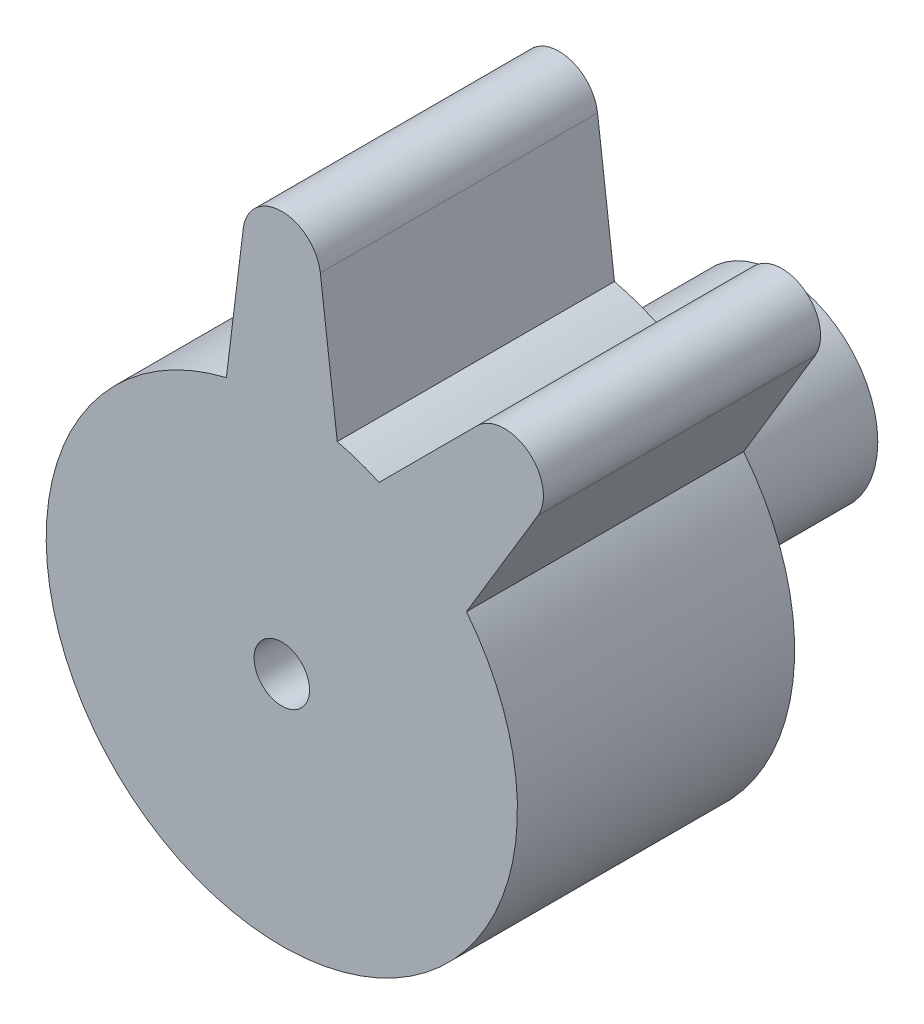
ISO-10303-21;
HEADER;
FILE_DESCRIPTION(('STEP AP214'),'2;1');
FILE_NAME('part.step','',(''),(''),'','','');
FILE_SCHEMA(('AUTOMOTIVE_DESIGN { 1 0 10303 214 1 1 1 1 }'));
ENDSEC;
DATA;
#1=APPLICATION_CONTEXT('core data for automotive mechanical design processes');
#2=APPLICATION_PROTOCOL_DEFINITION('international standard','automotive_design',2000,#1);
#3=PRODUCT_CONTEXT('',#1,'mechanical');
#4=PRODUCT('Part','Part','',(#3));
#5=PRODUCT_RELATED_PRODUCT_CATEGORY('part','',(#4));
#6=PRODUCT_DEFINITION_FORMATION('','',#4);
#7=PRODUCT_DEFINITION_CONTEXT('part definition',#1,'design');
#8=PRODUCT_DEFINITION('design','',#6,#7);
#9=PRODUCT_DEFINITION_SHAPE('','',#8);
#10=(LENGTH_UNIT() NAMED_UNIT(*) SI_UNIT(.MILLI.,.METRE.));
#11=(NAMED_UNIT(*) PLANE_ANGLE_UNIT() SI_UNIT($,.RADIAN.));
#12=(NAMED_UNIT(*) SI_UNIT($,.STERADIAN.) SOLID_ANGLE_UNIT());
#13=UNCERTAINTY_MEASURE_WITH_UNIT(LENGTH_MEASURE(1.E-05),#10,'distance_accuracy_value','');
#14=(GEOMETRIC_REPRESENTATION_CONTEXT(3) GLOBAL_UNCERTAINTY_ASSIGNED_CONTEXT((#13)) GLOBAL_UNIT_ASSIGNED_CONTEXT((#10,
#11,#12)) REPRESENTATION_CONTEXT('',''));
#15=CARTESIAN_POINT('',(0.,0.,0.));
#16=DIRECTION('',(0.,0.,1.));
#17=DIRECTION('',(1.,0.,0.));
#18=AXIS2_PLACEMENT_3D('',#15,#16,#17);
#19=CARTESIAN_POINT('',(0.,0.,0.));
#20=DIRECTION('',(0.,0.,1.));
#21=DIRECTION('',(1.,0.,0.));
#22=AXIS2_PLACEMENT_3D('',#19,#20,#21);
#23=PLANE('',#22);
#24=CARTESIAN_POINT('',(0.,0.,0.));
#25=DIRECTION('',(0.,0.,1.));
#26=DIRECTION('',(1.,0.,0.));
#27=AXIS2_PLACEMENT_3D('',#24,#25,#26);
#28=CIRCLE('',#27,1.);
#29=CARTESIAN_POINT('',(1.,0.,0.));
#30=VERTEX_POINT('',#29);
#31=EDGE_CURVE('E142',#30,#30,#28,.T.);
#32=ORIENTED_EDGE('',*,*,#31,.T.);
#33=EDGE_LOOP('',(#32));
#34=FACE_BOUND('',#33,.T.);
#35=CARTESIAN_POINT('',(0.,0.,0.));
#36=DIRECTION('',(0.,0.,-1.));
#37=DIRECTION('',(-1.,0.,0.));
#38=AXIS2_PLACEMENT_3D('',#35,#36,#37);
#39=CIRCLE('',#38,2.);
#40=CARTESIAN_POINT('',(-2.,0.,0.));
#41=VERTEX_POINT('',#40);
#42=EDGE_CURVE('E249',#41,#41,#39,.T.);
#43=ORIENTED_EDGE('',*,*,#42,.T.);
#44=EDGE_LOOP('',(#43));
#45=FACE_BOUND('',#44,.T.);
#46=ADVANCED_FACE('F35',(#34,#45),#23,.F.);
#47=CARTESIAN_POINT('',(0.,0.,10.));
#48=DIRECTION('',(0.,0.,-1.));
#49=DIRECTION('',(-1.,0.,0.));
#50=AXIS2_PLACEMENT_3D('',#47,#48,#49);
#51=CYLINDRICAL_SURFACE('',#50,8.5);
#52=CARTESIAN_POINT('',(0.,0.,0.));
#53=DIRECTION('',(0.,0.,1.));
#54=DIRECTION('',(1.,0.,0.));
#55=AXIS2_PLACEMENT_3D('',#52,#53,#54);
#56=CIRCLE('',#55,8.5);
#57=CARTESIAN_POINT('',(-2.,8.26135582092915,0.));
#58=VERTEX_POINT('',#57);
#59=CARTESIAN_POINT('',(6.66222002011691,5.27871427561234,0.));
#60=VERTEX_POINT('',#59);
#61=EDGE_CURVE('E145',#58,#60,#56,.T.);
#62=ORIENTED_EDGE('',*,*,#61,.T.);
#63=DIRECTION('',(0.,0.,-1.));
#64=VECTOR('',#63,1.);
#65=CARTESIAN_POINT('',(6.66222002011691,5.27871427561234,10.));
#66=LINE('',#65,#64);
#67=CARTESIAN_POINT('',(6.66222002011691,5.27871427561234,10.));
#68=VERTEX_POINT('',#67);
#69=EDGE_CURVE('E50',#68,#60,#66,.T.);
#70=ORIENTED_EDGE('',*,*,#69,.F.);
#71=CARTESIAN_POINT('',(0.,0.,10.));
#72=DIRECTION('',(0.,0.,1.));
#73=DIRECTION('',(1.,0.,0.));
#74=AXIS2_PLACEMENT_3D('',#71,#72,#73);
#75=CIRCLE('',#74,8.5);
#76=CARTESIAN_POINT('',(-2.,8.26135582092915,10.));
#77=VERTEX_POINT('',#76);
#78=EDGE_CURVE('E260',#77,#68,#75,.T.);
#79=ORIENTED_EDGE('',*,*,#78,.F.);
#80=DIRECTION('',(0.,0.,-1.));
#81=VECTOR('',#80,1.);
#82=CARTESIAN_POINT('',(-2.,8.26135582092915,10.));
#83=LINE('',#82,#81);
#84=EDGE_CURVE('E59',#77,#58,#83,.T.);
#85=ORIENTED_EDGE('',*,*,#84,.T.);
#86=EDGE_LOOP('',(#62,#70,#79,#85));
#87=FACE_BOUND('',#86,.T.);
#88=ADVANCED_FACE('F229',(#87),#51,.T.);
#89=CARTESIAN_POINT('',(2.56455740077132,-1.54094154735917,10.));
#90=DIRECTION('',(-0.857167300702111,0.515038074910056,0.));
#91=DIRECTION('',(-0.515038074910056,-0.857167300702112,0.));
#92=AXIS2_PLACEMENT_3D('',#89,#90,#91);
#93=PLANE('',#92);
#94=DIRECTION('',(0.515038074910056,0.857167300702112,0.));
#95=VECTOR('',#94,1.);
#96=CARTESIAN_POINT('',(2.56455740077132,-1.54094154735917,0.));
#97=LINE('',#96,#95);
#98=CARTESIAN_POINT('',(9.23741039466719,9.56455077912289,0.));
#99=VERTEX_POINT('',#98);
#100=EDGE_CURVE('E148',#60,#99,#97,.T.);
#101=ORIENTED_EDGE('',*,*,#100,.T.);
#102=DIRECTION('',(0.,0.,-1.));
#103=VECTOR('',#102,1.);
#104=CARTESIAN_POINT('',(9.23741039466719,9.56455077912289,10.));
#105=LINE('',#104,#103);
#106=CARTESIAN_POINT('',(9.23741039466719,9.56455077912289,10.));
#107=VERTEX_POINT('',#106);
#108=EDGE_CURVE('E171',#107,#99,#105,.T.);
#109=ORIENTED_EDGE('',*,*,#108,.F.);
#110=DIRECTION('',(0.515038074910056,0.857167300702112,0.));
#111=VECTOR('',#110,1.);
#112=CARTESIAN_POINT('',(2.56455740077132,-1.54094154735917,10.));
#113=LINE('',#112,#111);
#114=EDGE_CURVE('E98',#68,#107,#113,.T.);
#115=ORIENTED_EDGE('',*,*,#114,.F.);
#116=ORIENTED_EDGE('',*,*,#69,.T.);
#117=EDGE_LOOP('',(#101,#109,#115,#116));
#118=FACE_BOUND('',#117,.T.);
#119=ADVANCED_FACE('F235',(#118),#93,.F.);
#120=CARTESIAN_POINT('',(8.03643599281354,10.2861690016569,10.));
#121=DIRECTION('',(0.,0.,-1.));
#122=DIRECTION('',(-1.,0.,0.));
#123=AXIS2_PLACEMENT_3D('',#120,#121,#122);
#124=CYLINDRICAL_SURFACE('',#123,1.40109684640317);
#125=CARTESIAN_POINT('',(8.03643599281354,10.2861690016569,0.));
#126=DIRECTION('',(0.,0.,1.));
#127=DIRECTION('',(1.,0.,0.));
#128=AXIS2_PLACEMENT_3D('',#125,#126,#127);
#129=CIRCLE('',#128,1.40109684640317);
#130=CARTESIAN_POINT('',(7.04571091162277,11.2768940828477,0.));
#131=VERTEX_POINT('',#130);
#132=EDGE_CURVE('E151',#99,#131,#129,.T.);
#133=ORIENTED_EDGE('',*,*,#132,.T.);
#134=DIRECTION('',(0.,0.,-1.));
#135=VECTOR('',#134,1.);
#136=CARTESIAN_POINT('',(7.04571091162277,11.2768940828477,10.));
#137=LINE('',#136,#135);
#138=CARTESIAN_POINT('',(7.04571091162277,11.2768940828477,10.));
#139=VERTEX_POINT('',#138);
#140=EDGE_CURVE('E169',#139,#131,#137,.T.);
#141=ORIENTED_EDGE('',*,*,#140,.F.);
#142=CARTESIAN_POINT('',(8.03643599281354,10.2861690016569,10.));
#143=DIRECTION('',(0.,0.,1.));
#144=DIRECTION('',(1.,0.,0.));
#145=AXIS2_PLACEMENT_3D('',#142,#143,#144);
#146=CIRCLE('',#145,1.40109684640317);
#147=EDGE_CURVE('E263',#107,#139,#146,.T.);
#148=ORIENTED_EDGE('',*,*,#147,.F.);
#149=ORIENTED_EDGE('',*,*,#108,.T.);
#150=EDGE_LOOP('',(#133,#141,#148,#149));
#151=FACE_BOUND('',#150,.T.);
#152=ADVANCED_FACE('F232',(#151),#124,.T.);
#153=CARTESIAN_POINT('',(-2.11559158561248,2.11559158561249,10.));
#154=DIRECTION('',(-0.707106781186546,0.707106781186549,0.));
#155=DIRECTION('',(-0.707106781186549,-0.707106781186546,0.));
#156=AXIS2_PLACEMENT_3D('',#153,#154,#155);
#157=PLANE('',#156);
#158=DIRECTION('',(0.707106781186549,0.707106781186546,0.));
#159=VECTOR('',#158,1.);
#160=CARTESIAN_POINT('',(-2.11559158561248,2.11559158561249,0.));
#161=LINE('',#160,#159);
#162=CARTESIAN_POINT('',(3.51017700569002,7.74136017691497,0.));
#163=VERTEX_POINT('',#162);
#164=EDGE_CURVE('E154',#163,#131,#161,.T.);
#165=ORIENTED_EDGE('',*,*,#164,.F.);
#166=DIRECTION('',(0.,0.,-1.));
#167=VECTOR('',#166,1.);
#168=CARTESIAN_POINT('',(3.51017700569002,7.74136017691497,10.));
#169=LINE('',#168,#167);
#170=CARTESIAN_POINT('',(3.51017700569002,7.74136017691497,10.));
#171=VERTEX_POINT('',#170);
#172=EDGE_CURVE('E167',#171,#163,#169,.T.);
#173=ORIENTED_EDGE('',*,*,#172,.F.);
#174=DIRECTION('',(0.707106781186549,0.707106781186546,0.));
#175=VECTOR('',#174,1.);
#176=CARTESIAN_POINT('',(-2.11559158561248,2.11559158561249,10.));
#177=LINE('',#176,#175);
#178=EDGE_CURVE('E264',#171,#139,#177,.T.);
#179=ORIENTED_EDGE('',*,*,#178,.T.);
#180=ORIENTED_EDGE('',*,*,#140,.T.);
#181=EDGE_LOOP('',(#165,#173,#179,#180));
#182=FACE_BOUND('',#181,.T.);
#183=ADVANCED_FACE('F227',(#182),#157,.T.);
#184=CARTESIAN_POINT('',(2.,8.26135582092915,0.));
#185=VERTEX_POINT('',#184);
#186=EDGE_CURVE('E149',#163,#185,#56,.T.);
#187=ORIENTED_EDGE('',*,*,#186,.T.);
#188=DIRECTION('',(0.,0.,-1.));
#189=VECTOR('',#188,1.);
#190=CARTESIAN_POINT('',(2.,8.26135582092915,10.));
#191=LINE('',#190,#189);
#192=CARTESIAN_POINT('',(2.,8.26135582092915,10.));
#193=VERTEX_POINT('',#192);
#194=EDGE_CURVE('E134',#193,#185,#191,.T.);
#195=ORIENTED_EDGE('',*,*,#194,.F.);
#196=EDGE_CURVE('E122',#171,#193,#75,.T.);
#197=ORIENTED_EDGE('',*,*,#196,.F.);
#198=ORIENTED_EDGE('',*,*,#172,.T.);
#199=EDGE_LOOP('',(#187,#195,#197,#198));
#200=FACE_BOUND('',#199,.T.);
#201=ADVANCED_FACE('F224',(#200),#51,.T.);
#202=CARTESIAN_POINT('',(2.96959715648726,0.364620682917803,10.));
#203=DIRECTION('',(-0.992546151641322,-0.121869343405148,0.));
#204=DIRECTION('',(0.121869343405148,-0.992546151641322,0.));
#205=AXIS2_PLACEMENT_3D('',#202,#203,#204);
#206=PLANE('',#205);
#207=DIRECTION('',(-0.121869343405148,0.992546151641322,0.));
#208=VECTOR('',#207,1.);
#209=CARTESIAN_POINT('',(2.96959715648726,0.364620682917803,0.));
#210=LINE('',#209,#208);
#211=CARTESIAN_POINT('',(1.39065328297426,13.2240865791358,0.));
#212=VERTEX_POINT('',#211);
#213=EDGE_CURVE('E131',#185,#212,#210,.T.);
#214=ORIENTED_EDGE('',*,*,#213,.T.);
#215=DIRECTION('',(0.,0.,-1.));
#216=VECTOR('',#215,1.);
#217=CARTESIAN_POINT('',(1.39065328297426,13.2240865791358,10.));
#218=LINE('',#217,#216);
#219=CARTESIAN_POINT('',(1.39065328297426,13.2240865791358,10.));
#220=VERTEX_POINT('',#219);
#221=EDGE_CURVE('E128',#220,#212,#218,.T.);
#222=ORIENTED_EDGE('',*,*,#221,.F.);
#223=DIRECTION('',(-0.121869343405148,0.992546151641322,0.));
#224=VECTOR('',#223,1.);
#225=CARTESIAN_POINT('',(2.96959715648726,0.364620682917803,10.));
#226=LINE('',#225,#224);
#227=EDGE_CURVE('E114',#193,#220,#226,.T.);
#228=ORIENTED_EDGE('',*,*,#227,.F.);
#229=ORIENTED_EDGE('',*,*,#194,.T.);
#230=EDGE_LOOP('',(#214,#222,#228,#229));
#231=FACE_BOUND('',#230,.T.);
#232=ADVANCED_FACE('F129',(#231),#206,.F.);
#233=CARTESIAN_POINT('',(0.,13.0533358264176,10.));
#234=DIRECTION('',(0.,0.,-1.));
#235=DIRECTION('',(-1.,0.,0.));
#236=AXIS2_PLACEMENT_3D('',#233,#234,#235);
#237=CYLINDRICAL_SURFACE('',#236,1.40109684640317);
#238=CARTESIAN_POINT('',(0.,13.0533358264176,0.));
#239=DIRECTION('',(0.,0.,1.));
#240=DIRECTION('',(1.,0.,0.));
#241=AXIS2_PLACEMENT_3D('',#238,#239,#240);
#242=CIRCLE('',#241,1.40109684640317);
#243=CARTESIAN_POINT('',(-1.39065328297426,13.2240865791358,0.));
#244=VERTEX_POINT('',#243);
#245=EDGE_CURVE('E158',#244,#212,#242,.F.);
#246=ORIENTED_EDGE('',*,*,#245,.F.);
#247=DIRECTION('',(0.,0.,-1.));
#248=VECTOR('',#247,1.);
#249=CARTESIAN_POINT('',(-1.39065328297426,13.2240865791358,10.));
#250=LINE('',#249,#248);
#251=CARTESIAN_POINT('',(-1.39065328297426,13.2240865791358,10.));
#252=VERTEX_POINT('',#251);
#253=EDGE_CURVE('E85',#252,#244,#250,.T.);
#254=ORIENTED_EDGE('',*,*,#253,.F.);
#255=CARTESIAN_POINT('',(0.,13.0533358264176,10.));
#256=DIRECTION('',(0.,0.,1.));
#257=DIRECTION('',(1.,0.,0.));
#258=AXIS2_PLACEMENT_3D('',#255,#256,#257);
#259=CIRCLE('',#258,1.40109684640317);
#260=EDGE_CURVE('E119',#252,#220,#259,.F.);
#261=ORIENTED_EDGE('',*,*,#260,.T.);
#262=ORIENTED_EDGE('',*,*,#221,.T.);
#263=EDGE_LOOP('',(#246,#254,#261,#262));
#264=FACE_BOUND('',#263,.T.);
#265=ADVANCED_FACE('F136',(#264),#237,.T.);
#266=CARTESIAN_POINT('',(0.,0.,10.));
#267=DIRECTION('',(0.,0.,-1.));
#268=DIRECTION('',(-1.,0.,0.));
#269=AXIS2_PLACEMENT_3D('',#266,#267,#268);
#270=CYLINDRICAL_SURFACE('',#269,1.);
#271=CARTESIAN_POINT('',(0.,0.,10.));
#272=DIRECTION('',(0.,0.,1.));
#273=DIRECTION('',(1.,0.,0.));
#274=AXIS2_PLACEMENT_3D('',#271,#272,#273);
#275=CIRCLE('',#274,1.);
#276=CARTESIAN_POINT('',(1.,0.,10.));
#277=VERTEX_POINT('',#276);
#278=EDGE_CURVE('E163',#277,#277,#275,.T.);
#279=ORIENTED_EDGE('',*,*,#278,.T.);
#280=EDGE_LOOP('',(#279));
#281=FACE_BOUND('',#280,.T.);
#282=ORIENTED_EDGE('',*,*,#31,.F.);
#283=EDGE_LOOP('',(#282));
#284=FACE_BOUND('',#283,.T.);
#285=ADVANCED_FACE('F37',(#281,#284),#270,.F.);
#286=CARTESIAN_POINT('',(-2.96959715648726,0.364620682917804,10.));
#287=DIRECTION('',(-0.992546151641322,0.121869343405148,0.));
#288=DIRECTION('',(-0.121869343405148,-0.992546151641322,0.));
#289=AXIS2_PLACEMENT_3D('',#286,#287,#288);
#290=PLANE('',#289);
#291=DIRECTION('',(0.121869343405148,0.992546151641322,0.));
#292=VECTOR('',#291,1.);
#293=CARTESIAN_POINT('',(-2.96959715648726,0.364620682917804,0.));
#294=LINE('',#293,#292);
#295=EDGE_CURVE('E160',#58,#244,#294,.T.);
#296=ORIENTED_EDGE('',*,*,#295,.F.);
#297=ORIENTED_EDGE('',*,*,#84,.F.);
#298=DIRECTION('',(0.121869343405148,0.992546151641322,0.));
#299=VECTOR('',#298,1.);
#300=CARTESIAN_POINT('',(-2.96959715648726,0.364620682917804,10.));
#301=LINE('',#300,#299);
#302=EDGE_CURVE('E137',#77,#252,#301,.T.);
#303=ORIENTED_EDGE('',*,*,#302,.T.);
#304=ORIENTED_EDGE('',*,*,#253,.T.);
#305=EDGE_LOOP('',(#296,#297,#303,#304));
#306=FACE_BOUND('',#305,.T.);
#307=ADVANCED_FACE('F213',(#306),#290,.T.);
#308=CARTESIAN_POINT('',(0.,0.,10.));
#309=DIRECTION('',(0.,0.,1.));
#310=DIRECTION('',(1.,0.,0.));
#311=AXIS2_PLACEMENT_3D('',#308,#309,#310);
#312=PLANE('',#311);
#313=ORIENTED_EDGE('',*,*,#278,.F.);
#314=EDGE_LOOP('',(#313));
#315=FACE_BOUND('',#314,.T.);
#316=ORIENTED_EDGE('',*,*,#78,.T.);
#317=ORIENTED_EDGE('',*,*,#114,.T.);
#318=ORIENTED_EDGE('',*,*,#147,.T.);
#319=ORIENTED_EDGE('',*,*,#178,.F.);
#320=ORIENTED_EDGE('',*,*,#196,.T.);
#321=ORIENTED_EDGE('',*,*,#227,.T.);
#322=ORIENTED_EDGE('',*,*,#260,.F.);
#323=ORIENTED_EDGE('',*,*,#302,.F.);
#324=EDGE_LOOP('',(#316,#317,#318,#319,#320,#321,#322,#323));
#325=FACE_BOUND('',#324,.T.);
#326=ADVANCED_FACE('F116',(#315,#325),#312,.T.);
#327=CARTESIAN_POINT('',(0.,0.,0.));
#328=DIRECTION('',(0.,0.,1.));
#329=DIRECTION('',(1.,0.,0.));
#330=AXIS2_PLACEMENT_3D('',#327,#328,#329);
#331=CIRCLE('',#330,3.5);
#332=CARTESIAN_POINT('',(3.5,0.,0.));
#333=VERTEX_POINT('',#332);
#334=EDGE_CURVE('E11',#333,#333,#331,.F.);
#335=ORIENTED_EDGE('',*,*,#334,.F.);
#336=EDGE_LOOP('',(#335));
#337=FACE_BOUND('',#336,.T.);
#338=ORIENTED_EDGE('',*,*,#61,.F.);
#339=ORIENTED_EDGE('',*,*,#295,.T.);
#340=ORIENTED_EDGE('',*,*,#245,.T.);
#341=ORIENTED_EDGE('',*,*,#213,.F.);
#342=ORIENTED_EDGE('',*,*,#186,.F.);
#343=ORIENTED_EDGE('',*,*,#164,.T.);
#344=ORIENTED_EDGE('',*,*,#132,.F.);
#345=ORIENTED_EDGE('',*,*,#100,.F.);
#346=EDGE_LOOP('',(#338,#339,#340,#341,#342,#343,#344,#345));
#347=FACE_BOUND('',#346,.T.);
#348=ADVANCED_FACE('F212',(#337,#347),#23,.F.);
#349=CARTESIAN_POINT('',(0.,0.,-8.));
#350=DIRECTION('',(0.,0.,-1.));
#351=DIRECTION('',(-1.,0.,0.));
#352=AXIS2_PLACEMENT_3D('',#349,#350,#351);
#353=PLANE('',#352);
#354=CARTESIAN_POINT('',(0.,0.,-8.));
#355=DIRECTION('',(0.,0.,-1.));
#356=DIRECTION('',(-1.,0.,0.));
#357=AXIS2_PLACEMENT_3D('',#354,#355,#356);
#358=CIRCLE('',#357,3.5);
#359=CARTESIAN_POINT('',(-3.5,0.,-8.));
#360=VERTEX_POINT('',#359);
#361=EDGE_CURVE('E146',#360,#360,#358,.T.);
#362=ORIENTED_EDGE('',*,*,#361,.T.);
#363=EDGE_LOOP('',(#362));
#364=FACE_BOUND('',#363,.T.);
#365=CARTESIAN_POINT('',(0.,0.,-8.));
#366=DIRECTION('',(0.,0.,-1.));
#367=DIRECTION('',(-1.,0.,0.));
#368=AXIS2_PLACEMENT_3D('',#365,#366,#367);
#369=CIRCLE('',#368,2.);
#370=CARTESIAN_POINT('',(-2.,0.,-8.));
#371=VERTEX_POINT('',#370);
#372=EDGE_CURVE('E251',#371,#371,#369,.T.);
#373=ORIENTED_EDGE('',*,*,#372,.F.);
#374=EDGE_LOOP('',(#373));
#375=FACE_BOUND('',#374,.T.);
#376=ADVANCED_FACE('F207',(#364,#375),#353,.T.);
#377=CARTESIAN_POINT('',(0.,0.,-8.));
#378=DIRECTION('',(0.,0.,1.));
#379=DIRECTION('',(1.,0.,0.));
#380=AXIS2_PLACEMENT_3D('',#377,#378,#379);
#381=CYLINDRICAL_SURFACE('',#380,3.5);
#382=CARTESIAN_POINT('',(3.5,0.,-3.5));
#383=CARTESIAN_POINT('',(3.49999934647171,-0.0549774511886256,-3.49999903021903));
#384=CARTESIAN_POINT('',(3.49869208701023,-0.109964873936291,-3.49545110551194));
#385=CARTESIAN_POINT('',(3.4936045297255,-0.218345995598494,-3.47741786494884));
#386=CARTESIAN_POINT('',(3.48982329605034,-0.271739083414807,-3.46392916696296));
#387=CARTESIAN_POINT('',(3.48020345674544,-0.375352150368936,-3.42849598079175));
#388=CARTESIAN_POINT('',(3.474367720532,-0.425576440424114,-3.40656328192402));
#389=CARTESIAN_POINT('',(3.46124989158242,-0.521634380564634,-3.35491100426084));
#390=CARTESIAN_POINT('',(3.45396764753901,-0.567467570589077,-3.32519061075486));
#391=CARTESIAN_POINT('',(3.43852367312902,-0.654647223429478,-3.2579824946635));
#392=CARTESIAN_POINT('',(3.4303452097302,-0.69586186119049,-3.22032762307222));
#393=CARTESIAN_POINT('',(3.41413367457396,-0.771485678962155,-3.13867612843131));
#394=CARTESIAN_POINT('',(3.40610062478085,-0.805893838538838,-3.09467855618443));
#395=CARTESIAN_POINT('',(3.39091507439313,-0.867598950032228,-3.00050320860399));
#396=CARTESIAN_POINT('',(3.38378351259108,-0.894739105517028,-2.95021900746547));
#397=CARTESIAN_POINT('',(3.37145671914235,-0.940125852769615,-2.84556399412672));
#398=CARTESIAN_POINT('',(3.36626107099664,-0.958374357777524,-2.7911940639724));
#399=CARTESIAN_POINT('',(3.35856804120241,-0.984992165068876,-2.68138261841595));
#400=CARTESIAN_POINT('',(3.35600489366891,-0.993602766016075,-2.62600431860089));
#401=CARTESIAN_POINT('',(3.35367104182518,-1.00145333894795,-2.51453442575838));
#402=CARTESIAN_POINT('',(3.35389973075333,-1.00069534704803,-2.45844299036685));
#403=CARTESIAN_POINT('',(3.35706517184156,-0.990020673813953,-2.3490656942732));
#404=CARTESIAN_POINT('',(3.35991391343389,-0.980401628641805,-2.29574782440996));
#405=CARTESIAN_POINT('',(3.36785674196985,-0.952756930429097,-2.19151639018586));
#406=CARTESIAN_POINT('',(3.37295103189706,-0.934730517406289,-2.14060304363966));
#407=CARTESIAN_POINT('',(3.38488431756517,-0.890553405689019,-2.04187687778419));
#408=CARTESIAN_POINT('',(3.39174458202416,-0.864302755864396,-1.99411146379919));
#409=CARTESIAN_POINT('',(3.40642608441438,-0.804491895839434,-1.90356171939327));
#410=CARTESIAN_POINT('',(3.41424753611068,-0.770930058366727,-1.86077850113254));
#411=CARTESIAN_POINT('',(3.43033125328062,-0.695951998365101,-1.77971381219682));
#412=CARTESIAN_POINT('',(3.43859902286152,-0.654287437422663,-1.74166276201639));
#413=CARTESIAN_POINT('',(3.45438123609203,-0.565066141193113,-1.67303699817986));
#414=CARTESIAN_POINT('',(3.46189564068921,-0.517509100740946,-1.64246267197914));
#415=CARTESIAN_POINT('',(3.47538264032742,-0.417461536545722,-1.58953563261298));
#416=CARTESIAN_POINT('',(3.48134637748612,-0.364944908905002,-1.56722985659791));
#417=CARTESIAN_POINT('',(3.49099625743795,-0.256696614983734,-1.53183305429159));
#418=CARTESIAN_POINT('',(3.49468297428128,-0.200965762905073,-1.51873970537736));
#419=CARTESIAN_POINT('',(3.49927437257336,-0.0898331943221744,-1.50251335714527));
#420=CARTESIAN_POINT('',(3.50026636425301,-0.0344806734302532,-1.49906765231349));
#421=CARTESIAN_POINT('',(3.49961042353544,0.0760132634027914,-1.50136363315052));
#422=CARTESIAN_POINT('',(3.49796280790308,0.131154703878553,-1.50710421642296));
#423=CARTESIAN_POINT('',(3.49226963342609,0.238509316715159,-1.52735522215813));
#424=CARTESIAN_POINT('',(3.48827306508862,0.290759105867427,-1.54168659066171));
#425=CARTESIAN_POINT('',(3.4783399937092,0.392104343102815,-1.57850025099232));
#426=CARTESIAN_POINT('',(3.47240326632854,0.441199425624338,-1.60098348544461));
#427=CARTESIAN_POINT('',(3.45904980584657,0.536020842560038,-1.65401166832262));
#428=CARTESIAN_POINT('',(3.45160381589488,0.581651243270127,-1.68472059941289));
#429=CARTESIAN_POINT('',(3.43608973548903,0.667219264029655,-1.75312625297532));
#430=CARTESIAN_POINT('',(3.42802150376367,0.707155585421215,-1.79082456503143));
#431=CARTESIAN_POINT('',(3.41184309815947,0.781553214170353,-1.8736046710256));
#432=CARTESIAN_POINT('',(3.40374018433795,0.81579271370477,-1.91888763778285));
#433=CARTESIAN_POINT('',(3.38869447362751,0.876197658032581,-2.01473129430901));
#434=CARTESIAN_POINT('',(3.3817516363796,0.902363383738855,-2.06529180037321));
#435=CARTESIAN_POINT('',(3.36989325638715,0.945687270594172,-2.17004560549588));
#436=CARTESIAN_POINT('',(3.36496700079018,0.962893166212217,-2.22421788178634));
#437=CARTESIAN_POINT('',(3.35771228398834,0.987897250353704,-2.33485496782719));
#438=CARTESIAN_POINT('',(3.35538303564047,0.995698289511611,-2.391319077551));
#439=CARTESIAN_POINT('',(3.35365851547575,1.00149012123096,-2.50264801646077));
#440=CARTESIAN_POINT('',(3.35415580399703,0.999840138221142,-2.55749275227629));
#441=CARTESIAN_POINT('',(3.35777298607399,0.987623554788215,-2.66608736533289));
#442=CARTESIAN_POINT('',(3.36089279211716,0.977057251899602,-2.7198372790465));
#443=CARTESIAN_POINT('',(3.36933488579116,0.947529844083142,-2.82418918558376));
#444=CARTESIAN_POINT('',(3.37463438524179,0.928655458931764,-2.87481769350544));
#445=CARTESIAN_POINT('',(3.38683651421364,0.883114746507969,-2.97222936724624));
#446=CARTESIAN_POINT('',(3.3937394274128,0.856447040215778,-3.01901185063665));
#447=CARTESIAN_POINT('',(3.40865834474881,0.795032732674125,-3.10909176090262));
#448=CARTESIAN_POINT('',(3.41670381589509,0.760046138613656,-3.15222069567097));
#449=CARTESIAN_POINT('',(3.43284922546139,0.683429920189678,-3.23211194790492));
#450=CARTESIAN_POINT('',(3.4409491770859,0.64179862536428,-3.2688726595554));
#451=CARTESIAN_POINT('',(3.45653979786176,0.551787160432695,-3.33591859216331));
#452=CARTESIAN_POINT('',(3.46400950518705,0.50326125117989,-3.36601349363481));
#453=CARTESIAN_POINT('',(3.47725697888987,0.401625264823331,-3.417572892511));
#454=CARTESIAN_POINT('',(3.48303566935144,0.348517712057369,-3.43904210596653));
#455=CARTESIAN_POINT('',(3.49163672362653,0.246458157667517,-3.47042377569772));
#456=CARTESIAN_POINT('',(3.49474842181038,0.197881503812195,-3.48148676834228));
#457=CARTESIAN_POINT('',(3.49893021926074,0.0995391843931833,-3.49627482862107));
#458=CARTESIAN_POINT('',(3.50000059166997,0.0497736788080458,-3.50000087798844));
#459=CARTESIAN_POINT('',(3.5,0.,-3.5));
#460=B_SPLINE_CURVE_WITH_KNOTS('',3,(#382,#383,#384,#385,#386,#387,#388,#389,#390,#391,#392,
#393,#394,#395,#396,#397,#398,#399,#400,#401,#402,#403,#404,#405,#406,#407,#408,#409,#410,#411,
#412,#413,#414,#415,#416,#417,#418,#419,#420,#421,#422,#423,#424,#425,#426,#427,#428,#429,#430,
#431,#432,#433,#434,#435,#436,#437,#438,#439,#440,#441,#442,#443,#444,#445,#446,#447,#448,#449,
#450,#451,#452,#453,#454,#455,#456,#457,#458,#459),.UNSPECIFIED.,.T.,.F.,(4,2,2,2,2,2,2,2,2,2,2,
2,2,2,2,2,2,2,2,2,2,2,2,2,2,2,2,2,2,2,2,2,2,2,2,2,2,2,4),(0.,0.164749656271172,0.32956166989759,
0.494144406447672,0.658744367717579,0.827239057653907,0.995758989368567,1.16766537650029,
1.33953475772405,1.50699754929408,1.67442394611628,1.83642392910678,1.99843855889074,
2.16250401641616,2.32660602784683,2.49689250297262,2.66718780073736,2.83843550548235,
3.00964002003317,3.17522728845111,3.34079468713335,3.50302570235771,3.66527548283776,
3.83103762668237,3.99683751589905,4.16806052438178,4.3392775747866,4.50957286677749,
4.6798165288708,4.84363340801449,5.00744482086202,5.16958548138845,5.33175484992001,
5.49933828438395,5.66696391547449,5.83888989478295,6.01072174610257,6.15989734012186,
6.30905297207072),.UNSPECIFIED.);
#461=CARTESIAN_POINT('',(3.5,0.,-3.5));
#462=VERTEX_POINT('',#461);
#463=EDGE_CURVE('E198',#462,#462,#460,.T.);
#464=ORIENTED_EDGE('',*,*,#463,.T.);
#465=EDGE_LOOP('',(#464));
#466=FACE_BOUND('',#465,.T.);
#467=CARTESIAN_POINT('',(-3.5,0.,-3.5));
#468=CARTESIAN_POINT('',(-3.49999934647171,0.0549774511886256,-3.49999903021903));
#469=CARTESIAN_POINT('',(-3.49869208701023,0.109964873936291,-3.49545110551194));
#470=CARTESIAN_POINT('',(-3.4936045297255,0.218345995598494,-3.47741786494884));
#471=CARTESIAN_POINT('',(-3.48982329605034,0.271739083414807,-3.46392916696296));
#472=CARTESIAN_POINT('',(-3.48020345674544,0.375352150368936,-3.42849598079175));
#473=CARTESIAN_POINT('',(-3.474367720532,0.425576440424114,-3.40656328192402));
#474=CARTESIAN_POINT('',(-3.46124989158242,0.521634380564634,-3.35491100426084));
#475=CARTESIAN_POINT('',(-3.45396764753901,0.567467570589077,-3.32519061075486));
#476=CARTESIAN_POINT('',(-3.43852367312902,0.654647223429478,-3.2579824946635));
#477=CARTESIAN_POINT('',(-3.4303452097302,0.69586186119049,-3.22032762307222));
#478=CARTESIAN_POINT('',(-3.41413367457396,0.771485678962155,-3.13867612843131));
#479=CARTESIAN_POINT('',(-3.40610062478085,0.805893838538838,-3.09467855618443));
#480=CARTESIAN_POINT('',(-3.39091507439313,0.867598950032228,-3.00050320860399));
#481=CARTESIAN_POINT('',(-3.38378351259108,0.894739105517028,-2.95021900746547));
#482=CARTESIAN_POINT('',(-3.37145671914235,0.940125852769615,-2.84556399412672));
#483=CARTESIAN_POINT('',(-3.36626107099664,0.958374357777524,-2.7911940639724));
#484=CARTESIAN_POINT('',(-3.35856804120241,0.984992165068876,-2.68138261841595));
#485=CARTESIAN_POINT('',(-3.35600489366891,0.993602766016075,-2.62600431860089));
#486=CARTESIAN_POINT('',(-3.35367104182518,1.00145333894795,-2.51453442575838));
#487=CARTESIAN_POINT('',(-3.35389973075333,1.00069534704803,-2.45844299036685));
#488=CARTESIAN_POINT('',(-3.35706517184156,0.990020673813953,-2.3490656942732));
#489=CARTESIAN_POINT('',(-3.35991391343389,0.980401628641805,-2.29574782440996));
#490=CARTESIAN_POINT('',(-3.36785674196985,0.952756930429097,-2.19151639018586));
#491=CARTESIAN_POINT('',(-3.37295103189706,0.934730517406289,-2.14060304363966));
#492=CARTESIAN_POINT('',(-3.38488431756517,0.890553405689019,-2.04187687778419));
#493=CARTESIAN_POINT('',(-3.39174458202416,0.864302755864396,-1.99411146379919));
#494=CARTESIAN_POINT('',(-3.40642608441438,0.804491895839434,-1.90356171939327));
#495=CARTESIAN_POINT('',(-3.41424753611068,0.770930058366727,-1.86077850113254));
#496=CARTESIAN_POINT('',(-3.43033125328062,0.695951998365101,-1.77971381219682));
#497=CARTESIAN_POINT('',(-3.43859902286152,0.654287437422663,-1.74166276201639));
#498=CARTESIAN_POINT('',(-3.45438123609203,0.565066141193113,-1.67303699817986));
#499=CARTESIAN_POINT('',(-3.46189564068921,0.517509100740946,-1.64246267197914));
#500=CARTESIAN_POINT('',(-3.47538264032742,0.417461536545722,-1.58953563261298));
#501=CARTESIAN_POINT('',(-3.48134637748612,0.364944908905002,-1.56722985659791));
#502=CARTESIAN_POINT('',(-3.49099625743795,0.256696614983734,-1.53183305429159));
#503=CARTESIAN_POINT('',(-3.49468297428128,0.200965762905073,-1.51873970537736));
#504=CARTESIAN_POINT('',(-3.49927437257336,0.0898331943221744,-1.50251335714527));
#505=CARTESIAN_POINT('',(-3.50026636425301,0.0344806734302532,-1.49906765231349));
#506=CARTESIAN_POINT('',(-3.49961042353544,-0.0760132634027914,-1.50136363315052));
#507=CARTESIAN_POINT('',(-3.49796280790308,-0.131154703878553,-1.50710421642296));
#508=CARTESIAN_POINT('',(-3.49226963342609,-0.238509316715159,-1.52735522215813));
#509=CARTESIAN_POINT('',(-3.48827306508862,-0.290759105867427,-1.54168659066171));
#510=CARTESIAN_POINT('',(-3.4783399937092,-0.392104343102815,-1.57850025099232));
#511=CARTESIAN_POINT('',(-3.47240326632854,-0.441199425624338,-1.60098348544461));
#512=CARTESIAN_POINT('',(-3.45904980584657,-0.536020842560038,-1.65401166832262));
#513=CARTESIAN_POINT('',(-3.45160381589488,-0.581651243270127,-1.68472059941289));
#514=CARTESIAN_POINT('',(-3.43608973548903,-0.667219264029655,-1.75312625297532));
#515=CARTESIAN_POINT('',(-3.42802150376367,-0.707155585421215,-1.79082456503143));
#516=CARTESIAN_POINT('',(-3.41184309815947,-0.781553214170353,-1.8736046710256));
#517=CARTESIAN_POINT('',(-3.40374018433795,-0.81579271370477,-1.91888763778285));
#518=CARTESIAN_POINT('',(-3.38869447362751,-0.876197658032581,-2.01473129430901));
#519=CARTESIAN_POINT('',(-3.3817516363796,-0.902363383738855,-2.06529180037321));
#520=CARTESIAN_POINT('',(-3.36989325638715,-0.945687270594172,-2.17004560549588));
#521=CARTESIAN_POINT('',(-3.36496700079018,-0.962893166212217,-2.22421788178634));
#522=CARTESIAN_POINT('',(-3.35771228398834,-0.987897250353704,-2.33485496782719));
#523=CARTESIAN_POINT('',(-3.35538303564047,-0.995698289511611,-2.391319077551));
#524=CARTESIAN_POINT('',(-3.35365851547575,-1.00149012123096,-2.50264801646077));
#525=CARTESIAN_POINT('',(-3.35415580399703,-0.999840138221142,-2.55749275227629));
#526=CARTESIAN_POINT('',(-3.35777298607399,-0.987623554788215,-2.66608736533289));
#527=CARTESIAN_POINT('',(-3.36089279211716,-0.977057251899602,-2.7198372790465));
#528=CARTESIAN_POINT('',(-3.36933488579116,-0.947529844083142,-2.82418918558376));
#529=CARTESIAN_POINT('',(-3.37463438524179,-0.928655458931764,-2.87481769350544));
#530=CARTESIAN_POINT('',(-3.38683651421364,-0.883114746507969,-2.97222936724624));
#531=CARTESIAN_POINT('',(-3.3937394274128,-0.856447040215778,-3.01901185063665));
#532=CARTESIAN_POINT('',(-3.40865834474881,-0.795032732674125,-3.10909176090262));
#533=CARTESIAN_POINT('',(-3.41670381589509,-0.760046138613656,-3.15222069567097));
#534=CARTESIAN_POINT('',(-3.43284922546139,-0.683429920189678,-3.23211194790492));
#535=CARTESIAN_POINT('',(-3.4409491770859,-0.64179862536428,-3.2688726595554));
#536=CARTESIAN_POINT('',(-3.45653979786176,-0.551787160432695,-3.33591859216331));
#537=CARTESIAN_POINT('',(-3.46400950518705,-0.50326125117989,-3.36601349363481));
#538=CARTESIAN_POINT('',(-3.47725697888987,-0.401625264823331,-3.417572892511));
#539=CARTESIAN_POINT('',(-3.48303566935144,-0.348517712057369,-3.43904210596653));
#540=CARTESIAN_POINT('',(-3.49163672362653,-0.246458157667517,-3.47042377569772));
#541=CARTESIAN_POINT('',(-3.49474842181038,-0.197881503812195,-3.48148676834228));
#542=CARTESIAN_POINT('',(-3.49893021926074,-0.0995391843931833,-3.49627482862107));
#543=CARTESIAN_POINT('',(-3.50000059166997,-0.0497736788080458,-3.50000087798844));
#544=CARTESIAN_POINT('',(-3.5,0.,-3.5));
#545=B_SPLINE_CURVE_WITH_KNOTS('',3,(#467,#468,#469,#470,#471,#472,#473,#474,#475,#476,#477,
#478,#479,#480,#481,#482,#483,#484,#485,#486,#487,#488,#489,#490,#491,#492,#493,#494,#495,#496,
#497,#498,#499,#500,#501,#502,#503,#504,#505,#506,#507,#508,#509,#510,#511,#512,#513,#514,#515,
#516,#517,#518,#519,#520,#521,#522,#523,#524,#525,#526,#527,#528,#529,#530,#531,#532,#533,#534,
#535,#536,#537,#538,#539,#540,#541,#542,#543,#544),.UNSPECIFIED.,.T.,.F.,(4,2,2,2,2,2,2,2,2,2,2,
2,2,2,2,2,2,2,2,2,2,2,2,2,2,2,2,2,2,2,2,2,2,2,2,2,2,2,4),(0.,0.164749656271172,0.32956166989759,
0.494144406447672,0.658744367717579,0.827239057653907,0.995758989368567,1.16766537650029,
1.33953475772405,1.50699754929408,1.67442394611628,1.83642392910678,1.99843855889074,
2.16250401641616,2.32660602784683,2.49689250297262,2.66718780073736,2.83843550548235,
3.00964002003317,3.17522728845111,3.34079468713335,3.50302570235771,3.66527548283776,
3.83103762668237,3.99683751589905,4.16806052438178,4.3392775747866,4.50957286677749,
4.6798165288708,4.84363340801449,5.00744482086202,5.16958548138845,5.33175484992001,
5.49933828438395,5.66696391547449,5.83888989478295,6.01072174610257,6.15989734012186,
6.30905297207072),.UNSPECIFIED.);
#546=CARTESIAN_POINT('',(-3.5,0.,-3.5));
#547=VERTEX_POINT('',#546);
#548=EDGE_CURVE('E192',#547,#547,#545,.T.);
#549=ORIENTED_EDGE('',*,*,#548,.T.);
#550=EDGE_LOOP('',(#549));
#551=FACE_BOUND('',#550,.T.);
#552=ORIENTED_EDGE('',*,*,#361,.F.);
#553=EDGE_LOOP('',(#552));
#554=FACE_BOUND('',#553,.T.);
#555=ORIENTED_EDGE('',*,*,#334,.T.);
#556=EDGE_LOOP('',(#555));
#557=FACE_BOUND('',#556,.T.);
#558=ADVANCED_FACE('F203',(#466,#551,#554,#557),#381,.T.);
#559=CARTESIAN_POINT('',(0.,0.,-8.));
#560=DIRECTION('',(0.,0.,1.));
#561=DIRECTION('',(1.,0.,0.));
#562=AXIS2_PLACEMENT_3D('',#559,#560,#561);
#563=CYLINDRICAL_SURFACE('',#562,2.);
#564=CARTESIAN_POINT('',(2.,0.,-3.5));
#565=CARTESIAN_POINT('',(1.99999713404151,-0.0525719629529865,-3.4999966976805));
#566=CARTESIAN_POINT('',(1.99790491019518,-0.105206599698033,-3.49582992687833));
#567=CARTESIAN_POINT('',(1.98974156037396,-0.208920235268425,-3.47934711965908));
#568=CARTESIAN_POINT('',(1.98366287828984,-0.259996086713504,-3.46701560700235));
#569=CARTESIAN_POINT('',(1.96816279403312,-0.358933544880575,-3.43480619138321));
#570=CARTESIAN_POINT('',(1.9587543917752,-0.40680680293918,-3.41495761575199));
#571=CARTESIAN_POINT('',(1.93745776515779,-0.498472616806565,-3.36842937863506));
#572=CARTESIAN_POINT('',(1.9255697363353,-0.54226549399005,-3.34175025575115));
#573=CARTESIAN_POINT('',(1.89956258258057,-0.627507817761919,-3.2804827505147));
#574=CARTESIAN_POINT('',(1.88535199127536,-0.668655211122112,-3.24551352076036));
#575=CARTESIAN_POINT('',(1.85659970246744,-0.744779444866978,-3.16947852075297));
#576=CARTESIAN_POINT('',(1.84205776209035,-0.779751583106767,-3.12840814822756));
#577=CARTESIAN_POINT('',(1.81298951197347,-0.845252000450279,-3.03751665047662));
#578=CARTESIAN_POINT('',(1.79855186970132,-0.875225335551638,-2.98726390165409));
#579=CARTESIAN_POINT('',(1.77285978772321,-0.926168226890696,-2.88163266401379));
#580=CARTESIAN_POINT('',(1.7616030760699,-0.947144214966334,-2.82625787127725));
#581=CARTESIAN_POINT('',(1.74457867037809,-0.978132442188589,-2.71533489457808));
#582=CARTESIAN_POINT('',(1.73852271583714,-0.988725857080441,-2.65999554793261));
#583=CARTESIAN_POINT('',(1.73181889948528,-1.00042699330885,-2.54802116222052));
#584=CARTESIAN_POINT('',(1.73116569343288,-1.00154408837307,-2.49138745912885));
#585=CARTESIAN_POINT('',(1.73510930257248,-0.994687287172295,-2.38571397568463));
#586=CARTESIAN_POINT('',(1.73908763662013,-0.987784559536822,-2.33657596877695));
#587=CARTESIAN_POINT('',(1.7507622873385,-0.966939849056933,-2.24027809062696));
#588=CARTESIAN_POINT('',(1.75845978831776,-0.952995623897652,-2.19311885469468));
#589=CARTESIAN_POINT('',(1.77687476412741,-0.918209780386004,-2.10077086743434));
#590=CARTESIAN_POINT('',(1.78765840663999,-0.897215067115995,-2.05565360121421));
#591=CARTESIAN_POINT('',(1.81103404281404,-0.849041687668003,-1.96936570740999));
#592=CARTESIAN_POINT('',(1.82362684780191,-0.821860243812468,-1.92819686439991));
#593=CARTESIAN_POINT('',(1.85113157903286,-0.758066054912789,-1.84547874725677));
#594=CARTESIAN_POINT('',(1.86613510236746,-0.720694458369282,-1.80454312642384));
#595=CARTESIAN_POINT('',(1.89547623300407,-0.639555578741373,-1.7292645814091));
#596=CARTESIAN_POINT('',(1.90981351958801,-0.595785256574285,-1.69492480796612));
#597=CARTESIAN_POINT('',(1.93701987282964,-0.500516505831848,-1.63231433897027));
#598=CARTESIAN_POINT('',(1.94978984162007,-0.448753591599408,-1.60439952755426));
#599=CARTESIAN_POINT('',(1.97157881121242,-0.340466215488797,-1.55790297095699));
#600=CARTESIAN_POINT('',(1.98060078943553,-0.283945576265276,-1.53931381498483));
#601=CARTESIAN_POINT('',(1.99324333741436,-0.172766491660701,-1.51352459628332));
#602=CARTESIAN_POINT('',(1.99724938301312,-0.118341530548324,-1.50550876425322));
#603=CARTESIAN_POINT('',(2.00073013459102,-0.00877959994935321,-1.49853526886551));
#604=CARTESIAN_POINT('',(2.00020698721312,0.0463570198699018,-1.49957331436052));
#605=CARTESIAN_POINT('',(1.99491192253441,0.151232971985994,-1.51020668841875));
#606=CARTESIAN_POINT('',(1.9904724568819,0.201059408049955,-1.51913253273003));
#607=CARTESIAN_POINT('',(1.97822171314819,0.298406892301917,-1.54423807189509));
#608=CARTESIAN_POINT('',(1.97041006334332,0.345927685690997,-1.56041856645336));
#609=CARTESIAN_POINT('',(1.95184251413669,0.438888608449666,-1.59999846643317));
#610=CARTESIAN_POINT('',(1.94100881769939,0.484230397006154,-1.62359105011681));
#611=CARTESIAN_POINT('',(1.91743974317109,0.570461361698922,-1.67710753564604));
#612=CARTESIAN_POINT('',(1.90470355565785,0.611348629775283,-1.70703413459343));
#613=CARTESIAN_POINT('',(1.87708221337464,0.691767689290654,-1.77576042533287));
#614=CARTESIAN_POINT('',(1.86210884848441,0.730772077824639,-1.81514286845357));
#615=CARTESIAN_POINT('',(1.83262391603874,0.80185632111324,-1.8999251512693));
#616=CARTESIAN_POINT('',(1.81811267381526,0.833931385690842,-1.94532911881637));
#617=CARTESIAN_POINT('',(1.79051192226068,0.891707914497696,-2.04364365420031));
#618=CARTESIAN_POINT('',(1.77752529663472,0.917025495878638,-2.0968112662086));
#619=CARTESIAN_POINT('',(1.75574072368126,0.958082826013803,-2.20751006769252));
#620=CARTESIAN_POINT('',(1.74693738240618,0.97383491588757,-2.26503552650119));
#621=CARTESIAN_POINT('',(1.73561501008667,0.993861687449679,-2.37691022286145));
#622=CARTESIAN_POINT('',(1.73257383460491,0.999092996400865,-2.43103425342904));
#623=CARTESIAN_POINT('',(1.73165354646175,1.00068915438079,-2.53944706717073));
#624=CARTESIAN_POINT('',(1.73377219627553,0.997057846624399,-2.59373576873943));
#625=CARTESIAN_POINT('',(1.74237862050025,0.981926125592263,-2.69548350153202));
#626=CARTESIAN_POINT('',(1.74843094482394,0.971208314342799,-2.7431004701444));
#627=CARTESIAN_POINT('',(1.76371016187918,0.943175358224645,-2.83580811942471));
#628=CARTESIAN_POINT('',(1.77293807569676,0.92585809115981,-2.88089798209197));
#629=CARTESIAN_POINT('',(1.79428530364528,0.883815745300683,-2.97062485098661));
#630=CARTESIAN_POINT('',(1.80655722396191,0.858671137816458,-3.0150279018297));
#631=CARTESIAN_POINT('',(1.8323533163459,0.802150971636634,-3.09927453618059));
#632=CARTESIAN_POINT('',(1.84587813794522,0.770772171238648,-3.13911573051849));
#633=CARTESIAN_POINT('',(1.87462323159313,0.698203326664641,-3.21814198235762));
#634=CARTESIAN_POINT('',(1.88984983311469,0.656284423010171,-3.25665910236192));
#635=CARTESIAN_POINT('',(1.91877752255088,0.566154806220279,-3.32626298342363));
#636=CARTESIAN_POINT('',(1.9324777860804,0.517940723256785,-3.35734573942629));
#637=CARTESIAN_POINT('',(1.95698009585103,0.415931596819946,-3.4112363627622));
#638=CARTESIAN_POINT('',(1.96776096562909,0.362099503934614,-3.43398416941144));
#639=CARTESIAN_POINT('',(1.98501341363465,0.250742101294191,-3.46980816791895));
#640=CARTESIAN_POINT('',(1.99149723372932,0.193227799623166,-3.48291184682958));
#641=CARTESIAN_POINT('',(1.99695461909663,0.112601946483384,-3.49389741107585));
#642=CARTESIAN_POINT('',(1.99809365339202,0.0901618794394987,-3.49618264086362));
#643=CARTESIAN_POINT('',(1.99961696977865,0.0451517318071578,-3.49923466551681));
#644=CARTESIAN_POINT('',(2.00000123103763,0.0225816476473815,-3.5000014184712));
#645=CARTESIAN_POINT('',(2.,0.,-3.5));
#646=B_SPLINE_CURVE_WITH_KNOTS('',3,(#564,#565,#566,#567,#568,#569,#570,#571,#572,#573,#574,
#575,#576,#577,#578,#579,#580,#581,#582,#583,#584,#585,#586,#587,#588,#589,#590,#591,#592,#593,
#594,#595,#596,#597,#598,#599,#600,#601,#602,#603,#604,#605,#606,#607,#608,#609,#610,#611,#612,
#613,#614,#615,#616,#617,#618,#619,#620,#621,#622,#623,#624,#625,#626,#627,#628,#629,#630,#631,
#632,#633,#634,#635,#636,#637,#638,#639,#640,#641,#642,#643,#644,#645),.UNSPECIFIED.,.T.,.F.,(4,
2,2,2,2,2,2,2,2,2,2,2,2,2,2,2,2,2,2,2,2,2,2,2,2,2,2,2,2,2,2,2,2,2,2,2,2,2,2,2,4),(0.,
0.157624257420293,0.315548149709198,0.472862155492298,0.630163760581568,0.796981758718089,
0.963926237654036,1.14381726430753,1.32357947898281,1.4925801214023,1.6614135732902,
1.81005712409321,1.95874803925679,2.11090240168487,2.26312521260222,2.43464941333878,
2.60625534598686,2.78583022214441,2.9652621691228,3.12983290471346,3.29432564511476,
3.44606906506122,3.59782921630932,3.75392856027899,3.91009450748339,4.08159610644419,
4.25321588615432,4.43314682159674,4.61284511940778,4.77529307498373,4.93767059860005,
5.08457930244183,5.23153528783678,5.38836456775614,5.54527561138958,5.72125242752499,
5.89732383376573,6.07464013662925,6.2514490862493,6.31915280137698,6.38685838514847),.UNSPECIFIED.);
#647=CARTESIAN_POINT('',(2.,0.,-3.5));
#648=VERTEX_POINT('',#647);
#649=EDGE_CURVE('E39',#648,#648,#646,.T.);
#650=ORIENTED_EDGE('',*,*,#649,.F.);
#651=EDGE_LOOP('',(#650));
#652=FACE_BOUND('',#651,.T.);
#653=CARTESIAN_POINT('',(-2.,0.,-3.5));
#654=CARTESIAN_POINT('',(-1.99999713404151,0.0525719629529865,-3.4999966976805));
#655=CARTESIAN_POINT('',(-1.99790491019518,0.105206599698033,-3.49582992687833));
#656=CARTESIAN_POINT('',(-1.98974156037396,0.208920235268425,-3.47934711965908));
#657=CARTESIAN_POINT('',(-1.98366287828984,0.259996086713504,-3.46701560700235));
#658=CARTESIAN_POINT('',(-1.96816279403312,0.358933544880575,-3.43480619138321));
#659=CARTESIAN_POINT('',(-1.9587543917752,0.40680680293918,-3.41495761575199));
#660=CARTESIAN_POINT('',(-1.93745776515779,0.498472616806565,-3.36842937863506));
#661=CARTESIAN_POINT('',(-1.9255697363353,0.54226549399005,-3.34175025575115));
#662=CARTESIAN_POINT('',(-1.89956258258057,0.627507817761919,-3.2804827505147));
#663=CARTESIAN_POINT('',(-1.88535199127536,0.668655211122112,-3.24551352076036));
#664=CARTESIAN_POINT('',(-1.85659970246744,0.744779444866978,-3.16947852075297));
#665=CARTESIAN_POINT('',(-1.84205776209035,0.779751583106767,-3.12840814822756));
#666=CARTESIAN_POINT('',(-1.81298951197347,0.845252000450279,-3.03751665047662));
#667=CARTESIAN_POINT('',(-1.79855186970132,0.875225335551638,-2.98726390165409));
#668=CARTESIAN_POINT('',(-1.77285978772321,0.926168226890696,-2.88163266401379));
#669=CARTESIAN_POINT('',(-1.7616030760699,0.947144214966334,-2.82625787127725));
#670=CARTESIAN_POINT('',(-1.74457867037809,0.978132442188589,-2.71533489457808));
#671=CARTESIAN_POINT('',(-1.73852271583714,0.988725857080441,-2.65999554793261));
#672=CARTESIAN_POINT('',(-1.73181889948528,1.00042699330885,-2.54802116222052));
#673=CARTESIAN_POINT('',(-1.73116569343288,1.00154408837307,-2.49138745912885));
#674=CARTESIAN_POINT('',(-1.73510930257248,0.994687287172295,-2.38571397568463));
#675=CARTESIAN_POINT('',(-1.73908763662013,0.987784559536822,-2.33657596877695));
#676=CARTESIAN_POINT('',(-1.7507622873385,0.966939849056933,-2.24027809062696));
#677=CARTESIAN_POINT('',(-1.75845978831776,0.952995623897652,-2.19311885469468));
#678=CARTESIAN_POINT('',(-1.77687476412741,0.918209780386004,-2.10077086743434));
#679=CARTESIAN_POINT('',(-1.78765840663999,0.897215067115995,-2.05565360121421));
#680=CARTESIAN_POINT('',(-1.81103404281404,0.849041687668003,-1.96936570740999));
#681=CARTESIAN_POINT('',(-1.82362684780191,0.821860243812468,-1.92819686439991));
#682=CARTESIAN_POINT('',(-1.85113157903286,0.758066054912789,-1.84547874725677));
#683=CARTESIAN_POINT('',(-1.86613510236746,0.720694458369282,-1.80454312642384));
#684=CARTESIAN_POINT('',(-1.89547623300407,0.639555578741373,-1.7292645814091));
#685=CARTESIAN_POINT('',(-1.90981351958801,0.595785256574285,-1.69492480796612));
#686=CARTESIAN_POINT('',(-1.93701987282964,0.500516505831848,-1.63231433897027));
#687=CARTESIAN_POINT('',(-1.94978984162007,0.448753591599408,-1.60439952755426));
#688=CARTESIAN_POINT('',(-1.97157881121242,0.340466215488797,-1.55790297095699));
#689=CARTESIAN_POINT('',(-1.98060078943553,0.283945576265276,-1.53931381498483));
#690=CARTESIAN_POINT('',(-1.99324333741436,0.172766491660701,-1.51352459628332));
#691=CARTESIAN_POINT('',(-1.99724938301312,0.118341530548324,-1.50550876425322));
#692=CARTESIAN_POINT('',(-2.00073013459102,0.00877959994935321,-1.49853526886551));
#693=CARTESIAN_POINT('',(-2.00020698721312,-0.0463570198699018,-1.49957331436052));
#694=CARTESIAN_POINT('',(-1.99491192253441,-0.151232971985994,-1.51020668841875));
#695=CARTESIAN_POINT('',(-1.9904724568819,-0.201059408049955,-1.51913253273003));
#696=CARTESIAN_POINT('',(-1.97822171314819,-0.298406892301917,-1.54423807189509));
#697=CARTESIAN_POINT('',(-1.97041006334332,-0.345927685690997,-1.56041856645336));
#698=CARTESIAN_POINT('',(-1.95184251413669,-0.438888608449666,-1.59999846643317));
#699=CARTESIAN_POINT('',(-1.94100881769939,-0.484230397006154,-1.62359105011681));
#700=CARTESIAN_POINT('',(-1.91743974317109,-0.570461361698922,-1.67710753564604));
#701=CARTESIAN_POINT('',(-1.90470355565785,-0.611348629775283,-1.70703413459343));
#702=CARTESIAN_POINT('',(-1.87708221337464,-0.691767689290654,-1.77576042533287));
#703=CARTESIAN_POINT('',(-1.86210884848441,-0.730772077824639,-1.81514286845357));
#704=CARTESIAN_POINT('',(-1.83262391603874,-0.80185632111324,-1.8999251512693));
#705=CARTESIAN_POINT('',(-1.81811267381526,-0.833931385690842,-1.94532911881637));
#706=CARTESIAN_POINT('',(-1.79051192226068,-0.891707914497696,-2.04364365420031));
#707=CARTESIAN_POINT('',(-1.77752529663472,-0.917025495878638,-2.0968112662086));
#708=CARTESIAN_POINT('',(-1.75574072368126,-0.958082826013803,-2.20751006769252));
#709=CARTESIAN_POINT('',(-1.74693738240618,-0.97383491588757,-2.26503552650119));
#710=CARTESIAN_POINT('',(-1.73561501008667,-0.993861687449679,-2.37691022286145));
#711=CARTESIAN_POINT('',(-1.73257383460491,-0.999092996400865,-2.43103425342904));
#712=CARTESIAN_POINT('',(-1.73165354646175,-1.00068915438079,-2.53944706717073));
#713=CARTESIAN_POINT('',(-1.73377219627553,-0.997057846624399,-2.59373576873943));
#714=CARTESIAN_POINT('',(-1.74237862050025,-0.981926125592263,-2.69548350153202));
#715=CARTESIAN_POINT('',(-1.74843094482394,-0.971208314342799,-2.7431004701444));
#716=CARTESIAN_POINT('',(-1.76371016187918,-0.943175358224645,-2.83580811942471));
#717=CARTESIAN_POINT('',(-1.77293807569676,-0.92585809115981,-2.88089798209197));
#718=CARTESIAN_POINT('',(-1.79428530364528,-0.883815745300683,-2.97062485098661));
#719=CARTESIAN_POINT('',(-1.80655722396191,-0.858671137816458,-3.0150279018297));
#720=CARTESIAN_POINT('',(-1.8323533163459,-0.802150971636634,-3.09927453618059));
#721=CARTESIAN_POINT('',(-1.84587813794522,-0.770772171238648,-3.13911573051849));
#722=CARTESIAN_POINT('',(-1.87462323159313,-0.698203326664641,-3.21814198235762));
#723=CARTESIAN_POINT('',(-1.88984983311469,-0.656284423010171,-3.25665910236192));
#724=CARTESIAN_POINT('',(-1.91877752255088,-0.566154806220279,-3.32626298342363));
#725=CARTESIAN_POINT('',(-1.9324777860804,-0.517940723256785,-3.35734573942629));
#726=CARTESIAN_POINT('',(-1.95698009585103,-0.415931596819946,-3.4112363627622));
#727=CARTESIAN_POINT('',(-1.96776096562909,-0.362099503934614,-3.43398416941144));
#728=CARTESIAN_POINT('',(-1.98501341363465,-0.250742101294191,-3.46980816791895));
#729=CARTESIAN_POINT('',(-1.99149723372932,-0.193227799623166,-3.48291184682958));
#730=CARTESIAN_POINT('',(-1.99695461909663,-0.112601946483384,-3.49389741107585));
#731=CARTESIAN_POINT('',(-1.99809365339202,-0.0901618794394987,-3.49618264086362));
#732=CARTESIAN_POINT('',(-1.99961696977865,-0.0451517318071578,-3.49923466551681));
#733=CARTESIAN_POINT('',(-2.00000123103763,-0.0225816476473815,-3.5000014184712));
#734=CARTESIAN_POINT('',(-2.,0.,-3.5));
#735=B_SPLINE_CURVE_WITH_KNOTS('',3,(#653,#654,#655,#656,#657,#658,#659,#660,#661,#662,#663,
#664,#665,#666,#667,#668,#669,#670,#671,#672,#673,#674,#675,#676,#677,#678,#679,#680,#681,#682,
#683,#684,#685,#686,#687,#688,#689,#690,#691,#692,#693,#694,#695,#696,#697,#698,#699,#700,#701,
#702,#703,#704,#705,#706,#707,#708,#709,#710,#711,#712,#713,#714,#715,#716,#717,#718,#719,#720,
#721,#722,#723,#724,#725,#726,#727,#728,#729,#730,#731,#732,#733,#734),.UNSPECIFIED.,.T.,.F.,(4,
2,2,2,2,2,2,2,2,2,2,2,2,2,2,2,2,2,2,2,2,2,2,2,2,2,2,2,2,2,2,2,2,2,2,2,2,2,2,2,4),(0.,
0.157624257420293,0.315548149709198,0.472862155492298,0.630163760581568,0.796981758718089,
0.963926237654036,1.14381726430753,1.32357947898281,1.4925801214023,1.6614135732902,
1.81005712409321,1.95874803925679,2.11090240168487,2.26312521260222,2.43464941333878,
2.60625534598686,2.78583022214441,2.9652621691228,3.12983290471346,3.29432564511476,
3.44606906506122,3.59782921630932,3.75392856027899,3.91009450748339,4.08159610644419,
4.25321588615432,4.43314682159674,4.61284511940778,4.77529307498373,4.93767059860005,
5.08457930244183,5.23153528783678,5.38836456775614,5.54527561138958,5.72125242752499,
5.89732383376573,6.07464013662925,6.2514490862493,6.31915280137698,6.38685838514847),.UNSPECIFIED.);
#736=CARTESIAN_POINT('',(-2.,0.,-3.5));
#737=VERTEX_POINT('',#736);
#738=EDGE_CURVE('E174',#737,#737,#735,.T.);
#739=ORIENTED_EDGE('',*,*,#738,.F.);
#740=EDGE_LOOP('',(#739));
#741=FACE_BOUND('',#740,.T.);
#742=ORIENTED_EDGE('',*,*,#372,.T.);
#743=EDGE_LOOP('',(#742));
#744=FACE_BOUND('',#743,.T.);
#745=ORIENTED_EDGE('',*,*,#42,.F.);
#746=EDGE_LOOP('',(#745));
#747=FACE_BOUND('',#746,.T.);
#748=ADVANCED_FACE('F179',(#652,#741,#744,#747),#563,.F.);
#749=CARTESIAN_POINT('',(-8.5,0.,-2.5));
#750=DIRECTION('',(1.,0.,0.));
#751=DIRECTION('',(0.,0.,-1.));
#752=AXIS2_PLACEMENT_3D('',#749,#750,#751);
#753=CYLINDRICAL_SURFACE('',#752,1.);
#754=ORIENTED_EDGE('',*,*,#738,.T.);
#755=EDGE_LOOP('',(#754));
#756=FACE_BOUND('',#755,.T.);
#757=ORIENTED_EDGE('',*,*,#548,.F.);
#758=EDGE_LOOP('',(#757));
#759=FACE_BOUND('',#758,.T.);
#760=ADVANCED_FACE('F185',(#756,#759),#753,.F.);
#761=ORIENTED_EDGE('',*,*,#649,.T.);
#762=EDGE_LOOP('',(#761));
#763=FACE_BOUND('',#762,.T.);
#764=ORIENTED_EDGE('',*,*,#463,.F.);
#765=EDGE_LOOP('',(#764));
#766=FACE_BOUND('',#765,.T.);
#767=ADVANCED_FACE('F182',(#763,#766),#753,.F.);
#768=CLOSED_SHELL('',(#46,#88,#119,#152,#183,#201,#232,#265,#285,#307,#326,#348,#376,#558,#748,
#760,#767));
#769=MANIFOLD_SOLID_BREP('B2',#768);
#770=ADVANCED_BREP_SHAPE_REPRESENTATION('',(#18,#769),#14);
#771=SHAPE_DEFINITION_REPRESENTATION(#9,#770);
ENDSEC;
END-ISO-10303-21;
